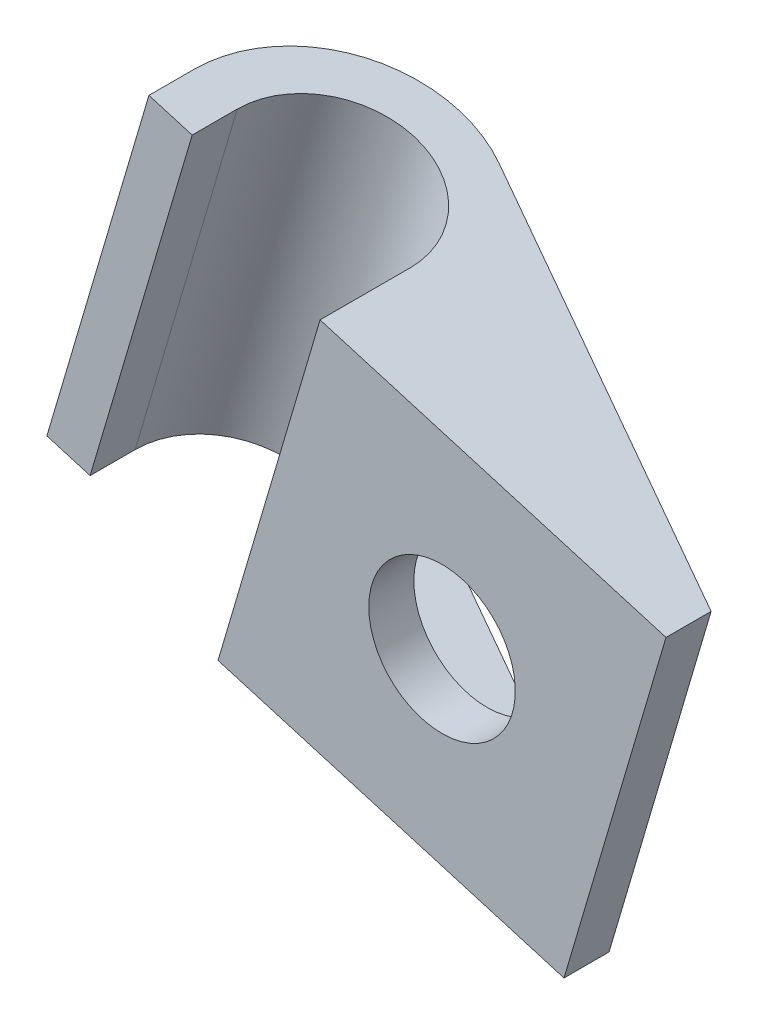
ISO-10303-21;
HEADER;
FILE_DESCRIPTION(('STEP AP214'),'2;1');
FILE_NAME('part.step','',(''),(''),'','','');
FILE_SCHEMA(('AUTOMOTIVE_DESIGN { 1 0 10303 214 1 1 1 1 }'));
ENDSEC;
DATA;
#1=APPLICATION_CONTEXT('core data for automotive mechanical design processes');
#2=APPLICATION_PROTOCOL_DEFINITION('international standard','automotive_design',2000,#1);
#3=PRODUCT_CONTEXT('',#1,'mechanical');
#4=PRODUCT('Part','Part','',(#3));
#5=PRODUCT_RELATED_PRODUCT_CATEGORY('part','',(#4));
#6=PRODUCT_DEFINITION_FORMATION('','',#4);
#7=PRODUCT_DEFINITION_CONTEXT('part definition',#1,'design');
#8=PRODUCT_DEFINITION('design','',#6,#7);
#9=PRODUCT_DEFINITION_SHAPE('','',#8);
#10=(LENGTH_UNIT() NAMED_UNIT(*) SI_UNIT(.MILLI.,.METRE.));
#11=(NAMED_UNIT(*) PLANE_ANGLE_UNIT() SI_UNIT($,.RADIAN.));
#12=(NAMED_UNIT(*) SI_UNIT($,.STERADIAN.) SOLID_ANGLE_UNIT());
#13=UNCERTAINTY_MEASURE_WITH_UNIT(LENGTH_MEASURE(1.E-05),#10,'distance_accuracy_value','');
#14=(GEOMETRIC_REPRESENTATION_CONTEXT(3) GLOBAL_UNCERTAINTY_ASSIGNED_CONTEXT((#13)) GLOBAL_UNIT_ASSIGNED_CONTEXT((#10,
#11,#12)) REPRESENTATION_CONTEXT('',''));
#15=CARTESIAN_POINT('',(0.,0.,0.));
#16=DIRECTION('',(0.,0.,1.));
#17=DIRECTION('',(1.,0.,0.));
#18=AXIS2_PLACEMENT_3D('',#15,#16,#17);
#19=CARTESIAN_POINT('',(-71.3208619206342,23.3633118787099,323.969905252879));
#20=DIRECTION('',(0.282878449037356,0.959155765801478,0.));
#21=DIRECTION('',(-1.15283646760491E-13,0.,-1.));
#22=AXIS2_PLACEMENT_3D('',#19,#20,#21);
#23=PLANE('',#22);
#24=DIRECTION('',(-0.882391305451068,0.260238735802686,-0.391996663827869));
#25=VECTOR('',#24,1.);
#26=CARTESIAN_POINT('',(-60.6622434731645,20.2198251137823,330.319905252877));
#27=LINE('',#26,#25);
#28=CARTESIAN_POINT('',(-60.6622434731645,20.2198251137823,330.319905252877));
#29=VERTEX_POINT('',#28);
#30=CARTESIAN_POINT('',(-74.0982085956537,24.1824192102622,324.351064138072));
#31=VERTEX_POINT('',#30);
#32=EDGE_CURVE('E221',#29,#31,#27,.T.);
#33=ORIENTED_EDGE('',*,*,#32,.T.);
#34=CARTESIAN_POINT('',(-75.8888412552631,24.7105204922503,328.732405252879));
#35=DIRECTION('',(0.282878449037356,0.959155765801478,0.));
#36=DIRECTION('',(0.959155765801478,-0.282878449037356,-1.16558847729675E-13));
#37=AXIS2_PLACEMENT_3D('',#34,#35,#36);
#38=CIRCLE('',#37,4.7625);
#39=CARTESIAN_POINT('',(-71.3208619206336,23.3633118787099,328.732405252879));
#40=VERTEX_POINT('',#39);
#41=EDGE_CURVE('E294',#40,#31,#38,.T.);
#42=ORIENTED_EDGE('',*,*,#41,.F.);
#43=DIRECTION('',(1.1872860521452E-13,0.,1.));
#44=VECTOR('',#43,1.);
#45=CARTESIAN_POINT('',(-71.3208619206342,23.3633118787099,323.969905252879));
#46=LINE('',#45,#44);
#47=CARTESIAN_POINT('',(-71.3208619206334,23.3633118787099,330.319905252879));
#48=VERTEX_POINT('',#47);
#49=EDGE_CURVE('E11',#40,#48,#46,.T.);
#50=ORIENTED_EDGE('',*,*,#49,.T.);
#51=DIRECTION('',(-0.959155765801478,0.282878449037356,1.1416663142382E-13));
#52=VECTOR('',#51,1.);
#53=CARTESIAN_POINT('',(-71.3208619206334,23.3633118787099,330.319905252879));
#54=LINE('',#53,#52);
#55=EDGE_CURVE('E190',#29,#48,#54,.T.);
#56=ORIENTED_EDGE('',*,*,#55,.F.);
#57=EDGE_LOOP('',(#33,#42,#50,#56));
#58=FACE_BOUND('',#57,.T.);
#59=ADVANCED_FACE('F16',(#58),#23,.T.);
#60=CARTESIAN_POINT('',(-68.6264446935533,32.499270547969,323.969905252878));
#61=DIRECTION('',(-0.282878449037356,-0.959155765801478,0.));
#62=DIRECTION('',(-0.959155765801478,0.282878449037356,0.));
#63=AXIS2_PLACEMENT_3D('',#60,#61,#62);
#64=PLANE('',#63);
#65=DIRECTION('',(0.882391305451068,-0.260238735802686,0.391996663827869));
#66=VECTOR('',#65,1.);
#67=CARTESIAN_POINT('',(-57.9678262460837,29.3557837830414,330.319905252877));
#68=LINE('',#67,#66);
#69=CARTESIAN_POINT('',(-71.4037913685729,33.3183778795213,324.351064138071));
#70=VERTEX_POINT('',#69);
#71=CARTESIAN_POINT('',(-57.9678262460837,29.3557837830414,330.319905252877));
#72=VERTEX_POINT('',#71);
#73=EDGE_CURVE('E172',#70,#72,#68,.T.);
#74=ORIENTED_EDGE('',*,*,#73,.T.);
#75=DIRECTION('',(0.959155765801478,-0.282878449037356,-1.1416663142382E-13));
#76=VECTOR('',#75,1.);
#77=CARTESIAN_POINT('',(-68.6264446935526,32.499270547969,330.319905252878));
#78=LINE('',#77,#76);
#79=CARTESIAN_POINT('',(-68.6264446935526,32.499270547969,330.319905252878));
#80=VERTEX_POINT('',#79);
#81=EDGE_CURVE('E183',#80,#72,#78,.T.);
#82=ORIENTED_EDGE('',*,*,#81,.F.);
#83=DIRECTION('',(1.1872860521452E-13,0.,1.));
#84=VECTOR('',#83,1.);
#85=CARTESIAN_POINT('',(-68.6264446935533,32.499270547969,323.969905252878));
#86=LINE('',#85,#84);
#87=CARTESIAN_POINT('',(-68.6264446935528,32.499270547969,328.732405252878));
#88=VERTEX_POINT('',#87);
#89=EDGE_CURVE('E26',#88,#80,#86,.T.);
#90=ORIENTED_EDGE('',*,*,#89,.F.);
#91=CARTESIAN_POINT('',(-73.1944240281823,33.8464791615094,328.732405252879));
#92=DIRECTION('',(0.282878449037356,0.959155765801478,0.));
#93=DIRECTION('',(-0.959155765801478,0.282878449037356,1.28214732502643E-13));
#94=AXIS2_PLACEMENT_3D('',#91,#92,#93);
#95=CIRCLE('',#94,4.7625);
#96=EDGE_CURVE('E186',#88,#70,#95,.T.);
#97=ORIENTED_EDGE('',*,*,#96,.T.);
#98=EDGE_LOOP('',(#74,#82,#90,#97));
#99=FACE_BOUND('',#98,.T.);
#100=ADVANCED_FACE('F181',(#99),#64,.T.);
#101=CARTESIAN_POINT('',(-71.3208619206342,23.3633118787099,323.969905252879));
#102=DIRECTION('',(0.959155765801478,-0.282878449037356,-1.1416663142382E-13));
#103=DIRECTION('',(0.,4.03589003730516E-13,-1.));
#104=AXIS2_PLACEMENT_3D('',#101,#102,#103);
#105=PLANE('',#104);
#106=DIRECTION('',(-0.282878449037356,-0.959155765801478,0.));
#107=VECTOR('',#106,1.);
#108=CARTESIAN_POINT('',(-67.1408414810621,37.536504355644,328.732405252878));
#109=LINE('',#108,#107);
#110=EDGE_CURVE('E237',#88,#40,#109,.T.);
#111=ORIENTED_EDGE('',*,*,#110,.F.);
#112=ORIENTED_EDGE('',*,*,#89,.T.);
#113=DIRECTION('',(0.282878449037356,0.959155765801478,0.));
#114=VECTOR('',#113,1.);
#115=CARTESIAN_POINT('',(-71.3208619206334,23.3633118787099,330.319905252879));
#116=LINE('',#115,#114);
#117=EDGE_CURVE('E203',#48,#80,#116,.T.);
#118=ORIENTED_EDGE('',*,*,#117,.F.);
#119=ORIENTED_EDGE('',*,*,#49,.F.);
#120=EDGE_LOOP('',(#111,#112,#118,#119));
#121=FACE_BOUND('',#120,.T.);
#122=ADVANCED_FACE('F360',(#121),#105,.T.);
#123=CARTESIAN_POINT('',(-76.3379107931099,23.1878607140405,328.732405252879));
#124=DIRECTION('',(0.282878449037356,0.959155765801478,0.));
#125=DIRECTION('',(-1.15283646760491E-13,0.,-1.));
#126=AXIS2_PLACEMENT_3D('',#123,#124,#125);
#127=PLANE('',#126);
#128=CARTESIAN_POINT('',(-76.3379107931099,23.1878607140405,328.732405252879));
#129=DIRECTION('',(-0.282878449037356,-0.959155765801478,0.));
#130=DIRECTION('',(0.959155765801478,-0.282878449037356,-1.22386790116159E-13));
#131=AXIS2_PLACEMENT_3D('',#128,#129,#130);
#132=CIRCLE('',#131,3.175);
#133=CARTESIAN_POINT('',(-79.3832303495296,24.0859997897341,328.73240525288));
#134=VERTEX_POINT('',#133);
#135=CARTESIAN_POINT('',(-73.2925912366902,22.2897216383469,328.732405252879));
#136=VERTEX_POINT('',#135);
#137=EDGE_CURVE('E272',#134,#136,#132,.T.);
#138=ORIENTED_EDGE('',*,*,#137,.F.);
#139=DIRECTION('',(-1.1872860521452E-13,0.,-1.));
#140=VECTOR('',#139,1.);
#141=CARTESIAN_POINT('',(-79.3832303495296,24.0859997897341,328.73240525288));
#142=LINE('',#141,#140);
#143=CARTESIAN_POINT('',(-79.3832303495294,24.0859997897341,330.31990525288));
#144=VERTEX_POINT('',#143);
#145=EDGE_CURVE('E243',#144,#134,#142,.T.);
#146=ORIENTED_EDGE('',*,*,#145,.F.);
#147=DIRECTION('',(0.959155765801478,-0.282878449037356,-1.14303223823504E-13));
#148=VECTOR('',#147,1.);
#149=CARTESIAN_POINT('',(-79.3832303495294,24.0859997897341,330.31990525288));
#150=LINE('',#149,#148);
#151=CARTESIAN_POINT('',(-80.9058901277393,24.5350693275809,330.31990525288));
#152=VERTEX_POINT('',#151);
#153=EDGE_CURVE('E217',#152,#144,#150,.T.);
#154=ORIENTED_EDGE('',*,*,#153,.F.);
#155=DIRECTION('',(1.1872860521452E-13,0.,1.));
#156=VECTOR('',#155,1.);
#157=CARTESIAN_POINT('',(-80.9058901277393,24.5350693275809,330.31990525288));
#158=LINE('',#157,#156);
#159=CARTESIAN_POINT('',(-80.9058901277395,24.5350693275809,328.73240525288));
#160=VERTEX_POINT('',#159);
#161=EDGE_CURVE('E157',#160,#152,#158,.T.);
#162=ORIENTED_EDGE('',*,*,#161,.F.);
#163=CARTESIAN_POINT('',(-76.3379107931099,23.1878607140405,328.732405252879));
#164=DIRECTION('',(0.282878449037356,0.959155765801478,0.));
#165=DIRECTION('',(-0.959155765801478,0.282878449037356,1.16558847729675E-13));
#166=AXIS2_PLACEMENT_3D('',#163,#164,#165);
#167=CIRCLE('',#166,4.7625);
#168=CARTESIAN_POINT('',(-74.5472781335005,22.6597594320523,324.351064138072));
#169=VERTEX_POINT('',#168);
#170=EDGE_CURVE('E287',#169,#160,#167,.T.);
#171=ORIENTED_EDGE('',*,*,#170,.F.);
#172=DIRECTION('',(-0.882391305451068,0.260238735802686,-0.391996663827869));
#173=VECTOR('',#172,1.);
#174=CARTESIAN_POINT('',(-61.1113130110113,18.6971653355725,330.319905252877));
#175=LINE('',#174,#173);
#176=CARTESIAN_POINT('',(-61.1113130110113,18.6971653355725,330.319905252877));
#177=VERTEX_POINT('',#176);
#178=EDGE_CURVE('E19',#177,#169,#175,.T.);
#179=ORIENTED_EDGE('',*,*,#178,.F.);
#180=DIRECTION('',(-1.1872860521452E-13,0.,-1.));
#181=VECTOR('',#180,1.);
#182=CARTESIAN_POINT('',(-61.1113130110111,18.6971653355725,331.907405252877));
#183=LINE('',#182,#181);
#184=CARTESIAN_POINT('',(-61.1113130110111,18.6971653355725,331.907405252877));
#185=VERTEX_POINT('',#184);
#186=EDGE_CURVE('E303',#185,#177,#183,.T.);
#187=ORIENTED_EDGE('',*,*,#186,.F.);
#188=DIRECTION('',(0.959155765801478,-0.282878449037356,-1.14289096103735E-13));
#189=VECTOR('',#188,1.);
#190=CARTESIAN_POINT('',(-73.2925912366899,22.2897216383469,331.907405252879));
#191=LINE('',#190,#189);
#192=CARTESIAN_POINT('',(-73.2925912366899,22.2897216383469,331.907405252879));
#193=VERTEX_POINT('',#192);
#194=EDGE_CURVE('E267',#193,#185,#191,.T.);
#195=ORIENTED_EDGE('',*,*,#194,.F.);
#196=DIRECTION('',(1.18990631989962E-13,0.,1.));
#197=VECTOR('',#196,1.);
#198=CARTESIAN_POINT('',(-73.2925912366902,22.2897216383469,328.732405252879));
#199=LINE('',#198,#197);
#200=EDGE_CURVE('E258',#136,#193,#199,.T.);
#201=ORIENTED_EDGE('',*,*,#200,.F.);
#202=EDGE_LOOP('',(#138,#146,#154,#162,#171,#179,#187,#195,#201));
#203=FACE_BOUND('',#202,.T.);
#204=ADVANCED_FACE('F347',(#203),#127,.F.);
#205=CARTESIAN_POINT('',(-72.7453544903355,35.3691389397193,328.732405252879));
#206=DIRECTION('',(0.282878449037356,0.959155765801478,0.));
#207=DIRECTION('',(-1.15283646760491E-13,0.,-1.));
#208=AXIS2_PLACEMENT_3D('',#205,#206,#207);
#209=PLANE('',#208);
#210=CARTESIAN_POINT('',(-72.7453544903355,35.3691389397193,328.732405252879));
#211=DIRECTION('',(-0.282878449037356,-0.959155765801478,0.));
#212=DIRECTION('',(0.959155765801478,-0.282878449037356,-1.22386790116159E-13));
#213=AXIS2_PLACEMENT_3D('',#210,#211,#212);
#214=CIRCLE('',#213,3.175);
#215=CARTESIAN_POINT('',(-75.7906740467552,36.2672780154129,328.732405252879));
#216=VERTEX_POINT('',#215);
#217=CARTESIAN_POINT('',(-69.7000349339158,34.4709998640257,328.732405252878));
#218=VERTEX_POINT('',#217);
#219=EDGE_CURVE('E259',#216,#218,#214,.T.);
#220=ORIENTED_EDGE('',*,*,#219,.T.);
#221=DIRECTION('',(1.18990631989962E-13,0.,1.));
#222=VECTOR('',#221,1.);
#223=CARTESIAN_POINT('',(-69.7000349339158,34.4709998640257,328.732405252878));
#224=LINE('',#223,#222);
#225=CARTESIAN_POINT('',(-69.7000349339154,34.4709998640257,331.907405252878));
#226=VERTEX_POINT('',#225);
#227=EDGE_CURVE('E116',#218,#226,#224,.T.);
#228=ORIENTED_EDGE('',*,*,#227,.T.);
#229=DIRECTION('',(0.959155765801478,-0.282878449037356,-1.14289096103735E-13));
#230=VECTOR('',#229,1.);
#231=CARTESIAN_POINT('',(-69.7000349339154,34.4709998640257,331.907405252878));
#232=LINE('',#231,#230);
#233=CARTESIAN_POINT('',(-57.5187567082367,30.8784435612512,331.907405252877));
#234=VERTEX_POINT('',#233);
#235=EDGE_CURVE('E234',#226,#234,#232,.T.);
#236=ORIENTED_EDGE('',*,*,#235,.T.);
#237=DIRECTION('',(-1.1872860521452E-13,0.,-1.));
#238=VECTOR('',#237,1.);
#239=CARTESIAN_POINT('',(-57.5187567082367,30.8784435612512,331.907405252877));
#240=LINE('',#239,#238);
#241=CARTESIAN_POINT('',(-57.5187567082369,30.8784435612512,330.319905252877));
#242=VERTEX_POINT('',#241);
#243=EDGE_CURVE('E108',#234,#242,#240,.T.);
#244=ORIENTED_EDGE('',*,*,#243,.T.);
#245=DIRECTION('',(-0.882391305451068,0.260238735802686,-0.391996663827869));
#246=VECTOR('',#245,1.);
#247=CARTESIAN_POINT('',(-57.5187567082369,30.8784435612512,330.319905252877));
#248=LINE('',#247,#246);
#249=CARTESIAN_POINT('',(-70.9547218307261,34.8410376577311,324.351064138071));
#250=VERTEX_POINT('',#249);
#251=EDGE_CURVE('E174',#242,#250,#248,.T.);
#252=ORIENTED_EDGE('',*,*,#251,.T.);
#253=CARTESIAN_POINT('',(-72.7453544903355,35.3691389397193,328.732405252879));
#254=DIRECTION('',(0.282878449037356,0.959155765801478,0.));
#255=DIRECTION('',(-0.959155765801478,0.282878449037356,1.16558847729675E-13));
#256=AXIS2_PLACEMENT_3D('',#253,#254,#255);
#257=CIRCLE('',#256,4.7625);
#258=CARTESIAN_POINT('',(-77.313333824965,36.7163475532597,328.732405252879));
#259=VERTEX_POINT('',#258);
#260=EDGE_CURVE('E238',#250,#259,#257,.T.);
#261=ORIENTED_EDGE('',*,*,#260,.T.);
#262=DIRECTION('',(1.1872860521452E-13,0.,1.));
#263=VECTOR('',#262,1.);
#264=CARTESIAN_POINT('',(-77.3133338249649,36.7163475532597,330.319905252879));
#265=LINE('',#264,#263);
#266=CARTESIAN_POINT('',(-77.3133338249649,36.7163475532597,330.319905252879));
#267=VERTEX_POINT('',#266);
#268=EDGE_CURVE('E249',#259,#267,#265,.T.);
#269=ORIENTED_EDGE('',*,*,#268,.T.);
#270=DIRECTION('',(0.959155765801478,-0.282878449037356,-1.14303223823504E-13));
#271=VECTOR('',#270,1.);
#272=CARTESIAN_POINT('',(-75.790674046755,36.2672780154129,330.319905252879));
#273=LINE('',#272,#271);
#274=CARTESIAN_POINT('',(-75.790674046755,36.2672780154129,330.319905252879));
#275=VERTEX_POINT('',#274);
#276=EDGE_CURVE('E214',#267,#275,#273,.T.);
#277=ORIENTED_EDGE('',*,*,#276,.T.);
#278=DIRECTION('',(-1.1872860521452E-13,0.,-1.));
#279=VECTOR('',#278,1.);
#280=CARTESIAN_POINT('',(-75.7906740467552,36.2672780154129,328.732405252879));
#281=LINE('',#280,#279);
#282=EDGE_CURVE('E40',#275,#216,#281,.T.);
#283=ORIENTED_EDGE('',*,*,#282,.T.);
#284=EDGE_LOOP('',(#220,#228,#236,#244,#252,#261,#269,#277,#283));
#285=FACE_BOUND('',#284,.T.);
#286=ADVANCED_FACE('F329',(#285),#209,.T.);
#287=CARTESIAN_POINT('',(-75.7906740467552,36.2672780154129,328.732405252879));
#288=DIRECTION('',(-0.959155765801478,0.282878449037356,1.1416663142382E-13));
#289=DIRECTION('',(1.19028249106569E-13,0.,1.));
#290=AXIS2_PLACEMENT_3D('',#287,#288,#289);
#291=PLANE('',#290);
#292=ORIENTED_EDGE('',*,*,#145,.T.);
#293=DIRECTION('',(-0.282878449037356,-0.959155765801478,0.));
#294=VECTOR('',#293,1.);
#295=CARTESIAN_POINT('',(-75.7906740467552,36.2672780154129,328.732405252879));
#296=LINE('',#295,#294);
#297=EDGE_CURVE('E254',#216,#134,#296,.T.);
#298=ORIENTED_EDGE('',*,*,#297,.F.);
#299=ORIENTED_EDGE('',*,*,#282,.F.);
#300=DIRECTION('',(-0.282878449037356,-0.959155765801478,0.));
#301=VECTOR('',#300,1.);
#302=CARTESIAN_POINT('',(-75.790674046755,36.2672780154129,330.319905252879));
#303=LINE('',#302,#301);
#304=EDGE_CURVE('E216',#275,#144,#303,.T.);
#305=ORIENTED_EDGE('',*,*,#304,.T.);
#306=EDGE_LOOP('',(#292,#298,#299,#305));
#307=FACE_BOUND('',#306,.T.);
#308=ADVANCED_FACE('F344',(#307),#291,.F.);
#309=CARTESIAN_POINT('',(-75.790674046755,36.2672780154129,330.319905252879));
#310=DIRECTION('',(-1.18859618602241E-13,0.,-1.));
#311=DIRECTION('',(-1.,0.,1.18859618602241E-13));
#312=AXIS2_PLACEMENT_3D('',#309,#310,#311);
#313=PLANE('',#312);
#314=ORIENTED_EDGE('',*,*,#153,.T.);
#315=ORIENTED_EDGE('',*,*,#304,.F.);
#316=ORIENTED_EDGE('',*,*,#276,.F.);
#317=DIRECTION('',(-0.282878449037356,-0.959155765801478,0.));
#318=VECTOR('',#317,1.);
#319=CARTESIAN_POINT('',(-77.3133338249649,36.7163475532597,330.319905252879));
#320=LINE('',#319,#318);
#321=EDGE_CURVE('E260',#267,#152,#320,.T.);
#322=ORIENTED_EDGE('',*,*,#321,.T.);
#323=EDGE_LOOP('',(#314,#315,#316,#322));
#324=FACE_BOUND('',#323,.T.);
#325=ADVANCED_FACE('F340',(#324),#313,.F.);
#326=CARTESIAN_POINT('',(-77.3133338249649,36.7163475532597,330.319905252879));
#327=DIRECTION('',(0.959155765801478,-0.282878449037356,-1.1416663142382E-13));
#328=DIRECTION('',(0.,4.03589003730516E-13,-1.));
#329=AXIS2_PLACEMENT_3D('',#326,#327,#328);
#330=PLANE('',#329);
#331=ORIENTED_EDGE('',*,*,#161,.T.);
#332=ORIENTED_EDGE('',*,*,#321,.F.);
#333=ORIENTED_EDGE('',*,*,#268,.F.);
#334=DIRECTION('',(-0.282878449037356,-0.959155765801478,0.));
#335=VECTOR('',#334,1.);
#336=CARTESIAN_POINT('',(-77.313333824965,36.7163475532597,328.732405252879));
#337=LINE('',#336,#335);
#338=EDGE_CURVE('E253',#259,#160,#337,.T.);
#339=ORIENTED_EDGE('',*,*,#338,.T.);
#340=EDGE_LOOP('',(#331,#332,#333,#339));
#341=FACE_BOUND('',#340,.T.);
#342=ADVANCED_FACE('F334',(#341),#330,.F.);
#343=CARTESIAN_POINT('',(-72.7453544903355,35.3691389397193,328.732405252879));
#344=DIRECTION('',(-0.282878449037356,-0.959155765801478,0.));
#345=DIRECTION('',(-0.959155765801478,0.282878449037356,1.16558847729675E-13));
#346=AXIS2_PLACEMENT_3D('',#343,#344,#345);
#347=CYLINDRICAL_SURFACE('',#346,4.7625);
#348=ORIENTED_EDGE('',*,*,#170,.T.);
#349=ORIENTED_EDGE('',*,*,#338,.F.);
#350=ORIENTED_EDGE('',*,*,#260,.F.);
#351=DIRECTION('',(-0.282878449037356,-0.959155765801478,0.));
#352=VECTOR('',#351,1.);
#353=CARTESIAN_POINT('',(-70.9547218307261,34.8410376577311,324.351064138071));
#354=LINE('',#353,#352);
#355=EDGE_CURVE('E189',#250,#70,#354,.T.);
#356=ORIENTED_EDGE('',*,*,#355,.T.);
#357=ORIENTED_EDGE('',*,*,#96,.F.);
#358=ORIENTED_EDGE('',*,*,#110,.T.);
#359=ORIENTED_EDGE('',*,*,#41,.T.);
#360=DIRECTION('',(-0.282878449037356,-0.959155765801478,0.));
#361=VECTOR('',#360,1.);
#362=CARTESIAN_POINT('',(-70.9547218307261,34.8410376577311,324.351064138071));
#363=LINE('',#362,#361);
#364=EDGE_CURVE('E177',#31,#169,#363,.T.);
#365=ORIENTED_EDGE('',*,*,#364,.T.);
#366=EDGE_LOOP('',(#348,#349,#350,#356,#357,#358,#359,#365));
#367=FACE_BOUND('',#366,.T.);
#368=ADVANCED_FACE('F332',(#367),#347,.T.);
#369=CARTESIAN_POINT('',(-57.5187567082367,30.8784435612512,331.907405252877));
#370=DIRECTION('',(-0.959155765801478,0.282878449037356,1.1416663142382E-13));
#371=DIRECTION('',(1.19028249106569E-13,0.,1.));
#372=AXIS2_PLACEMENT_3D('',#369,#370,#371);
#373=PLANE('',#372);
#374=ORIENTED_EDGE('',*,*,#186,.T.);
#375=DIRECTION('',(-0.282878449037356,-0.959155765801478,0.));
#376=VECTOR('',#375,1.);
#377=CARTESIAN_POINT('',(-57.5187567082369,30.8784435612512,330.319905252877));
#378=LINE('',#377,#376);
#379=EDGE_CURVE('E196',#29,#177,#378,.T.);
#380=ORIENTED_EDGE('',*,*,#379,.F.);
#381=DIRECTION('',(-0.282878449037356,-0.959155765801478,0.));
#382=VECTOR('',#381,1.);
#383=CARTESIAN_POINT('',(-60.6622434731645,20.2198251137823,330.319905252877));
#384=LINE('',#383,#382);
#385=EDGE_CURVE('E193',#72,#29,#384,.T.);
#386=ORIENTED_EDGE('',*,*,#385,.F.);
#387=DIRECTION('',(-0.282878449037356,-0.959155765801478,0.));
#388=VECTOR('',#387,1.);
#389=CARTESIAN_POINT('',(-57.5187567082369,30.8784435612512,330.319905252877));
#390=LINE('',#389,#388);
#391=EDGE_CURVE('E168',#242,#72,#390,.T.);
#392=ORIENTED_EDGE('',*,*,#391,.F.);
#393=ORIENTED_EDGE('',*,*,#243,.F.);
#394=DIRECTION('',(-0.282878449037356,-0.959155765801478,0.));
#395=VECTOR('',#394,1.);
#396=CARTESIAN_POINT('',(-57.5187567082367,30.8784435612512,331.907405252877));
#397=LINE('',#396,#395);
#398=EDGE_CURVE('E264',#234,#185,#397,.T.);
#399=ORIENTED_EDGE('',*,*,#398,.T.);
#400=EDGE_LOOP('',(#374,#380,#386,#392,#393,#399));
#401=FACE_BOUND('',#400,.T.);
#402=ADVANCED_FACE('F194',(#401),#373,.F.);
#403=CARTESIAN_POINT('',(-69.7000349339158,34.4709998640257,328.732405252878));
#404=DIRECTION('',(0.959155765801478,-0.282878449037356,-1.14439816223187E-13));
#405=DIRECTION('',(0.,4.04554735833109E-13,-1.));
#406=AXIS2_PLACEMENT_3D('',#403,#404,#405);
#407=PLANE('',#406);
#408=ORIENTED_EDGE('',*,*,#200,.T.);
#409=DIRECTION('',(-0.282878449037356,-0.959155765801478,0.));
#410=VECTOR('',#409,1.);
#411=CARTESIAN_POINT('',(-69.7000349339154,34.4709998640257,331.907405252878));
#412=LINE('',#411,#410);
#413=EDGE_CURVE('E210',#226,#193,#412,.T.);
#414=ORIENTED_EDGE('',*,*,#413,.F.);
#415=ORIENTED_EDGE('',*,*,#227,.F.);
#416=DIRECTION('',(-0.282878449037356,-0.959155765801478,0.));
#417=VECTOR('',#416,1.);
#418=CARTESIAN_POINT('',(-69.7000349339158,34.4709998640257,328.732405252878));
#419=LINE('',#418,#417);
#420=EDGE_CURVE('E269',#218,#136,#419,.T.);
#421=ORIENTED_EDGE('',*,*,#420,.T.);
#422=EDGE_LOOP('',(#408,#414,#415,#421));
#423=FACE_BOUND('',#422,.T.);
#424=ADVANCED_FACE('F349',(#423),#407,.F.);
#425=CARTESIAN_POINT('',(-72.7453544903355,35.3691389397193,328.732405252879));
#426=DIRECTION('',(-0.282878449037356,-0.959155765801478,0.));
#427=DIRECTION('',(-0.959155765801478,0.282878449037356,1.22386790116159E-13));
#428=AXIS2_PLACEMENT_3D('',#425,#426,#427);
#429=CYLINDRICAL_SURFACE('',#428,3.175);
#430=ORIENTED_EDGE('',*,*,#137,.T.);
#431=ORIENTED_EDGE('',*,*,#420,.F.);
#432=ORIENTED_EDGE('',*,*,#219,.F.);
#433=ORIENTED_EDGE('',*,*,#297,.T.);
#434=EDGE_LOOP('',(#430,#431,#432,#433));
#435=FACE_BOUND('',#434,.T.);
#436=ADVANCED_FACE('F346',(#435),#429,.F.);
#437=CARTESIAN_POINT('',(-57.5187567082369,30.8784435612512,330.319905252877));
#438=DIRECTION('',(-0.375985860285436,0.110887408291474,0.919966638279791));
#439=DIRECTION('',(0.282878449037429,0.959155765801457,0.));
#440=AXIS2_PLACEMENT_3D('',#437,#438,#439);
#441=PLANE('',#440);
#442=ORIENTED_EDGE('',*,*,#364,.F.);
#443=ORIENTED_EDGE('',*,*,#32,.F.);
#444=ORIENTED_EDGE('',*,*,#379,.T.);
#445=ORIENTED_EDGE('',*,*,#178,.T.);
#446=EDGE_LOOP('',(#442,#443,#444,#445));
#447=FACE_BOUND('',#446,.T.);
#448=ADVANCED_FACE('F357',(#447),#441,.F.);
#449=CARTESIAN_POINT('',(-57.5187567082369,30.8784435612512,330.319905252877));
#450=DIRECTION('',(-0.375985860285436,0.110887408291474,0.919966638279791));
#451=DIRECTION('',(0.282878449037429,0.959155765801457,0.));
#452=AXIS2_PLACEMENT_3D('',#449,#450,#451);
#453=PLANE('',#452);
#454=ORIENTED_EDGE('',*,*,#73,.F.);
#455=ORIENTED_EDGE('',*,*,#355,.F.);
#456=ORIENTED_EDGE('',*,*,#251,.F.);
#457=ORIENTED_EDGE('',*,*,#391,.T.);
#458=EDGE_LOOP('',(#454,#455,#456,#457));
#459=FACE_BOUND('',#458,.T.);
#460=ADVANCED_FACE('F170',(#459),#453,.F.);
#461=CARTESIAN_POINT('',(-68.6264446935526,32.499270547969,330.319905252878));
#462=DIRECTION('',(-1.1872860521452E-13,0.,-1.));
#463=DIRECTION('',(-1.,0.,1.1872860521452E-13));
#464=AXIS2_PLACEMENT_3D('',#461,#462,#463);
#465=PLANE('',#464);
#466=CARTESIAN_POINT('',(-65.4056739724635,26.5840825997991,330.319905252878));
#467=DIRECTION('',(1.1872860521452E-13,0.,1.));
#468=DIRECTION('',(0.282878449037357,0.959155765801478,0.));
#469=AXIS2_PLACEMENT_3D('',#466,#467,#468);
#470=CIRCLE('',#469,2.5796875);
#471=CARTESIAN_POINT('',(-64.6759359734624,29.0584047393901,330.319905252878));
#472=VERTEX_POINT('',#471);
#473=EDGE_CURVE('E230',#472,#472,#470,.T.);
#474=ORIENTED_EDGE('',*,*,#473,.T.);
#475=EDGE_LOOP('',(#474));
#476=FACE_BOUND('',#475,.T.);
#477=ORIENTED_EDGE('',*,*,#117,.T.);
#478=ORIENTED_EDGE('',*,*,#81,.T.);
#479=ORIENTED_EDGE('',*,*,#385,.T.);
#480=ORIENTED_EDGE('',*,*,#55,.T.);
#481=EDGE_LOOP('',(#477,#478,#479,#480));
#482=FACE_BOUND('',#481,.T.);
#483=ADVANCED_FACE('F201',(#476,#482),#465,.T.);
#484=CARTESIAN_POINT('',(-69.7000349339154,34.4709998640257,331.907405252878));
#485=DIRECTION('',(-1.18846067918367E-13,0.,-1.));
#486=DIRECTION('',(-1.,0.,1.18846067918367E-13));
#487=AXIS2_PLACEMENT_3D('',#484,#485,#486);
#488=PLANE('',#487);
#489=CARTESIAN_POINT('',(-65.4056739724633,26.5840825997991,331.907405252878));
#490=DIRECTION('',(-1.1872860521452E-13,0.,-1.));
#491=DIRECTION('',(0.282878449037357,0.959155765801478,0.));
#492=AXIS2_PLACEMENT_3D('',#489,#490,#491);
#493=CIRCLE('',#492,2.5796875);
#494=CARTESIAN_POINT('',(-64.6759359734622,29.0584047393901,331.907405252878));
#495=VERTEX_POINT('',#494);
#496=EDGE_CURVE('E229',#495,#495,#493,.T.);
#497=ORIENTED_EDGE('',*,*,#496,.T.);
#498=EDGE_LOOP('',(#497));
#499=FACE_BOUND('',#498,.T.);
#500=ORIENTED_EDGE('',*,*,#194,.T.);
#501=ORIENTED_EDGE('',*,*,#398,.F.);
#502=ORIENTED_EDGE('',*,*,#235,.F.);
#503=ORIENTED_EDGE('',*,*,#413,.T.);
#504=EDGE_LOOP('',(#500,#501,#502,#503));
#505=FACE_BOUND('',#504,.T.);
#506=ADVANCED_FACE('F352',(#499,#505),#488,.F.);
#507=CARTESIAN_POINT('',(-65.4056739724636,26.5840825997991,329.367405252878));
#508=DIRECTION('',(1.1872860521452E-13,0.,1.));
#509=DIRECTION('',(-0.282878449037357,-0.959155765801478,0.));
#510=AXIS2_PLACEMENT_3D('',#507,#508,#509);
#511=CYLINDRICAL_SURFACE('',#510,2.5796875);
#512=ORIENTED_EDGE('',*,*,#473,.F.);
#513=DIRECTION('',(1.1872860521452E-13,0.,1.));
#514=VECTOR('',#513,1.);
#515=CARTESIAN_POINT('',(-64.6759359734625,29.0584047393901,329.367405252878));
#516=LINE('',#515,#514);
#517=EDGE_CURVE('E225',#472,#495,#516,.T.);
#518=ORIENTED_EDGE('',*,*,#517,.T.);
#519=ORIENTED_EDGE('',*,*,#496,.F.);
#520=ORIENTED_EDGE('',*,*,#517,.F.);
#521=EDGE_LOOP('',(#512,#518,#519,#520));
#522=FACE_BOUND('',#521,.T.);
#523=ADVANCED_FACE('F503',(#522),#511,.F.);
#524=CLOSED_SHELL('',(#59,#100,#122,#204,#286,#308,#325,#342,#368,#402,#424,#436,#448,#460,#483,
#506,#523));
#525=MANIFOLD_SOLID_BREP('B1',#524);
#526=ADVANCED_BREP_SHAPE_REPRESENTATION('',(#18,#525),#14);
#527=SHAPE_DEFINITION_REPRESENTATION(#9,#526);
ENDSEC;
END-ISO-10303-21;
